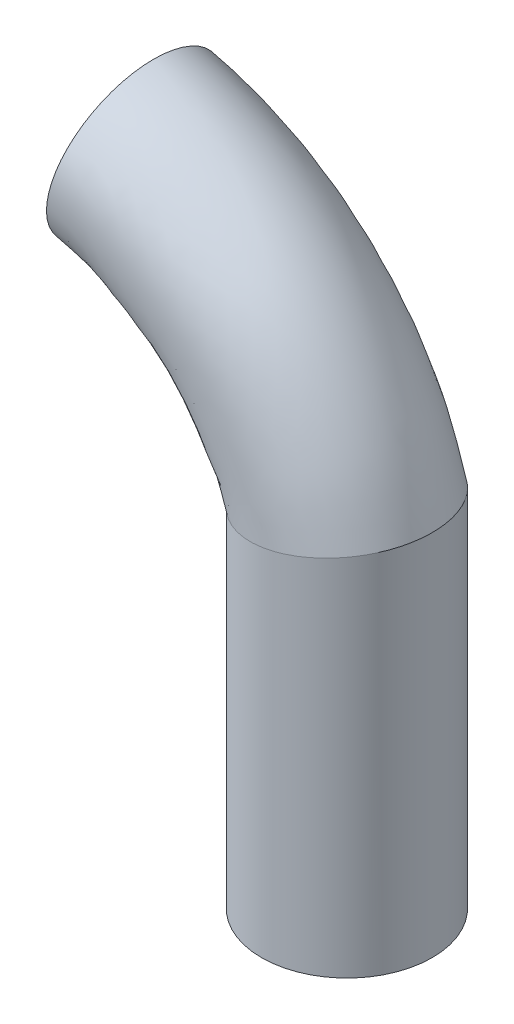
ISO-10303-21;
HEADER;
FILE_DESCRIPTION(('STEP AP214'),'2;1');
FILE_NAME('part.step','',(''),(''),'','','');
FILE_SCHEMA(('AUTOMOTIVE_DESIGN { 1 0 10303 214 1 1 1 1 }'));
ENDSEC;
DATA;
#1=APPLICATION_CONTEXT('core data for automotive mechanical design processes');
#2=APPLICATION_PROTOCOL_DEFINITION('international standard','automotive_design',2000,#1);
#3=PRODUCT_CONTEXT('',#1,'mechanical');
#4=PRODUCT('Part','Part','',(#3));
#5=PRODUCT_RELATED_PRODUCT_CATEGORY('part','',(#4));
#6=PRODUCT_DEFINITION_FORMATION('','',#4);
#7=PRODUCT_DEFINITION_CONTEXT('part definition',#1,'design');
#8=PRODUCT_DEFINITION('design','',#6,#7);
#9=PRODUCT_DEFINITION_SHAPE('','',#8);
#10=(LENGTH_UNIT() NAMED_UNIT(*) SI_UNIT(.MILLI.,.METRE.));
#11=(NAMED_UNIT(*) PLANE_ANGLE_UNIT() SI_UNIT($,.RADIAN.));
#12=(NAMED_UNIT(*) SI_UNIT($,.STERADIAN.) SOLID_ANGLE_UNIT());
#13=UNCERTAINTY_MEASURE_WITH_UNIT(LENGTH_MEASURE(1.E-05),#10,'distance_accuracy_value','');
#14=(GEOMETRIC_REPRESENTATION_CONTEXT(3) GLOBAL_UNCERTAINTY_ASSIGNED_CONTEXT((#13)) GLOBAL_UNIT_ASSIGNED_CONTEXT((#10,
#11,#12)) REPRESENTATION_CONTEXT('',''));
#15=CARTESIAN_POINT('',(0.,0.,0.));
#16=DIRECTION('',(0.,0.,1.));
#17=DIRECTION('',(1.,0.,0.));
#18=AXIS2_PLACEMENT_3D('',#15,#16,#17);
#19=CARTESIAN_POINT('',(0.,0.,0.));
#20=DIRECTION('',(0.,1.,0.));
#21=DIRECTION('',(0.,0.,1.));
#22=AXIS2_PLACEMENT_3D('',#19,#20,#21);
#23=PLANE('',#22);
#24=CARTESIAN_POINT('',(0.,0.,0.));
#25=DIRECTION('',(0.,1.,0.));
#26=DIRECTION('',(0.,0.,1.));
#27=AXIS2_PLACEMENT_3D('',#24,#25,#26);
#28=CIRCLE('',#27,12.);
#29=CARTESIAN_POINT('',(0.,0.,12.));
#30=VERTEX_POINT('',#29);
#31=EDGE_CURVE('E50',#30,#30,#28,.T.);
#32=ORIENTED_EDGE('',*,*,#31,.F.);
#33=EDGE_LOOP('',(#32));
#34=FACE_BOUND('',#33,.T.);
#35=CARTESIAN_POINT('',(0.,0.,0.));
#36=DIRECTION('',(0.,1.,0.));
#37=DIRECTION('',(0.,0.,1.));
#38=AXIS2_PLACEMENT_3D('',#35,#36,#37);
#39=CIRCLE('',#38,10.);
#40=CARTESIAN_POINT('',(0.,0.,10.));
#41=VERTEX_POINT('',#40);
#42=EDGE_CURVE('E63',#41,#41,#39,.T.);
#43=ORIENTED_EDGE('',*,*,#42,.T.);
#44=EDGE_LOOP('',(#43));
#45=FACE_BOUND('',#44,.T.);
#46=ADVANCED_FACE('F43',(#34,#45),#23,.F.);
#47=CARTESIAN_POINT('',(0.,83.9411254969543,0.));
#48=DIRECTION('',(0.,-1.,0.));
#49=DIRECTION('',(0.,0.,-1.));
#50=AXIS2_PLACEMENT_3D('',#47,#48,#49);
#51=CYLINDRICAL_SURFACE('',#50,12.);
#52=ORIENTED_EDGE('',*,*,#31,.T.);
#53=EDGE_LOOP('',(#52));
#54=FACE_BOUND('',#53,.T.);
#55=CARTESIAN_POINT('',(0.,50.,0.));
#56=DIRECTION('',(-0.145731138414527,0.989324231633091,0.));
#57=DIRECTION('',(-0.989324231633091,-0.145731138414527,0.));
#58=AXIS2_PLACEMENT_3D('',#55,#56,#57);
#59=ELLIPSE('',#58,12.1294916431911,12.);
#60=CARTESIAN_POINT('',(-12.,48.2323553744483,0.));
#61=VERTEX_POINT('',#60);
#62=EDGE_CURVE('E11',#61,#61,#59,.T.);
#63=ORIENTED_EDGE('',*,*,#62,.F.);
#64=EDGE_LOOP('',(#63));
#65=FACE_BOUND('',#64,.T.);
#66=ADVANCED_FACE('F45',(#54,#65),#51,.T.);
#67=CARTESIAN_POINT('',(-27.1865244931937,89.8319749303473,0.));
#68=DIRECTION('',(0.973416209225749,-0.229043409895531,0.));
#69=DIRECTION('',(0.229043409895531,0.973416209225749,0.));
#70=AXIS2_PLACEMENT_3D('',#67,#68,#69);
#71=PLANE('',#70);
#72=CARTESIAN_POINT('',(-29.9350454119401,78.1509804196383,0.));
#73=DIRECTION('',(0.973416209225749,-0.229043409895532,0.));
#74=DIRECTION('',(0.229043409895532,0.973416209225749,0.));
#75=AXIS2_PLACEMENT_3D('',#72,#73,#74);
#76=CIRCLE('',#75,10.);
#77=CARTESIAN_POINT('',(-27.6446113129848,87.8851425118958,0.));
#78=VERTEX_POINT('',#77);
#79=EDGE_CURVE('E66',#78,#78,#76,.T.);
#80=ORIENTED_EDGE('',*,*,#79,.T.);
#81=EDGE_LOOP('',(#80));
#82=FACE_BOUND('',#81,.T.);
#83=CARTESIAN_POINT('',(-29.9350454119401,78.1509804196383,0.));
#84=DIRECTION('',(0.973416209225749,-0.229043409895531,0.));
#85=DIRECTION('',(0.229043409895531,0.973416209225749,0.));
#86=AXIS2_PLACEMENT_3D('',#83,#84,#85);
#87=CIRCLE('',#86,12.);
#88=CARTESIAN_POINT('',(-27.1865244931937,89.8319749303473,0.));
#89=VERTEX_POINT('',#88);
#90=EDGE_CURVE('E54',#89,#89,#87,.T.);
#91=ORIENTED_EDGE('',*,*,#90,.F.);
#92=EDGE_LOOP('',(#91));
#93=FACE_BOUND('',#92,.T.);
#94=ADVANCED_FACE('F70',(#82,#93),#71,.F.);
#95=CARTESIAN_POINT('',(-12.,48.2323553744483,0.));
#96=CARTESIAN_POINT('',(-12.7534189153168,50.734230232803,0.));
#97=CARTESIAN_POINT('',(-14.0574493505172,52.632841728253,0.));
#98=CARTESIAN_POINT('',(-17.3401531125662,57.5272148967779,0.));
#99=CARTESIAN_POINT('',(-21.3478893027379,61.2998523237319,0.));
#100=CARTESIAN_POINT('',(-27.1475196938969,64.7183055808548,0.));
#101=CARTESIAN_POINT('',(-29.6803034720161,65.7633225521422,0.));
#102=CARTESIAN_POINT('',(-32.6835663306864,66.4699859089293,0.));
#103=CARTESIAN_POINT('',(-12.,48.2323553744483,24.));
#104=CARTESIAN_POINT('',(-13.5135996529393,53.258559044569,24.));
#105=CARTESIAN_POINT('',(-13.6706797899976,51.4174086569918,24.));
#106=CARTESIAN_POINT('',(-17.5214616967647,57.8782619977604,24.));
#107=CARTESIAN_POINT('',(-20.98738055443,61.1156205697922,24.));
#108=CARTESIAN_POINT('',(-28.5927876392981,65.0875673302378,24.));
#109=CARTESIAN_POINT('',(-26.7130080435762,65.0651222790669,24.));
#110=CARTESIAN_POINT('',(-32.6835663306864,66.4699859089293,24.));
#111=CARTESIAN_POINT('',(12.,51.7676446255517,24.));
#112=CARTESIAN_POINT('',(10.4864003470607,56.7938482956724,24.));
#113=CARTESIAN_POINT('',(8.89630519086534,61.0426016719502,24.));
#114=CARTESIAN_POINT('',(2.7144854367518,71.2312181352267,24.));
#115=CARTESIAN_POINT('',(-4.95506729208265,79.266728410204,24.));
#116=CARTESIAN_POINT('',(-16.2196387285254,86.2638680161331,24.));
#117=CARTESIAN_POINT('',(-21.2159662060835,88.4271113004849,24.));
#118=CARTESIAN_POINT('',(-27.1865244931937,89.8319749303473,24.));
#119=CARTESIAN_POINT('',(12.,51.7676446255517,0.));
#120=CARTESIAN_POINT('',(10.866490715872,55.5316838897894,0.));
#121=CARTESIAN_POINT('',(8.70292041060554,61.6503182075808,0.));
#122=CARTESIAN_POINT('',(2.80513972885107,71.0556945847354,0.));
#123=CARTESIAN_POINT('',(-5.1353216662366,79.3588442871738,0.));
#124=CARTESIAN_POINT('',(-15.4970047558247,86.0792371414416,0.));
#125=CARTESIAN_POINT('',(-22.6996139203035,88.7762114370226,0.));
#126=CARTESIAN_POINT('',(-27.1865244931937,89.8319749303473,0.));
#127=CARTESIAN_POINT('',(12.,51.7676446255517,-24.));
#128=CARTESIAN_POINT('',(11.2465810846833,54.2695194839065,-24.));
#129=CARTESIAN_POINT('',(8.50953563034573,62.2580347432115,-24.));
#130=CARTESIAN_POINT('',(2.89579402095035,70.8801710342442,-24.));
#131=CARTESIAN_POINT('',(-5.31557604039056,79.4509601641437,-24.));
#132=CARTESIAN_POINT('',(-14.7743707831241,85.8946062667501,-24.));
#133=CARTESIAN_POINT('',(-24.1832616345234,89.1253115735602,-24.));
#134=CARTESIAN_POINT('',(-27.1865244931937,89.8319749303473,-24.));
#135=CARTESIAN_POINT('',(-12.,48.2323553744483,-24.));
#136=CARTESIAN_POINT('',(-11.9932381776942,48.2099014210371,-24.));
#137=CARTESIAN_POINT('',(-14.4442189110368,53.8482747995142,-24.));
#138=CARTESIAN_POINT('',(-17.1588445283676,57.1761677957954,-24.));
#139=CARTESIAN_POINT('',(-21.7083980510459,61.4840840776716,-24.));
#140=CARTESIAN_POINT('',(-25.7022517484956,64.3490438314719,-24.));
#141=CARTESIAN_POINT('',(-32.6475989004561,66.4615228252174,-24.));
#142=CARTESIAN_POINT('',(-32.6835663306864,66.4699859089293,-24.));
#143=CARTESIAN_POINT('',(-12.,48.2323553744483,0.));
#144=CARTESIAN_POINT('',(-12.7534189153168,50.734230232803,0.));
#145=CARTESIAN_POINT('',(-14.0574493505172,52.632841728253,0.));
#146=CARTESIAN_POINT('',(-17.3401531125662,57.5272148967779,0.));
#147=CARTESIAN_POINT('',(-21.3478893027379,61.2998523237319,0.));
#148=CARTESIAN_POINT('',(-27.1475196938969,64.7183055808548,0.));
#149=CARTESIAN_POINT('',(-29.6803034720161,65.7633225521422,0.));
#150=CARTESIAN_POINT('',(-32.6835663306864,66.4699859089293,0.));
#151=(BOUNDED_SURFACE() B_SPLINE_SURFACE(3,3,((#95,#96,#97,#98,#99,#100,#101,#102),(#103,#104,
#105,#106,#107,#108,#109,#110),(#111,#112,#113,#114,#115,#116,#117,#118),(#119,#120,#121,#122,
#123,#124,#125,#126),(#127,#128,#129,#130,#131,#132,#133,#134),(#135,#136,#137,#138,#139,#140,
#141,#142),(#143,#144,#145,#146,#147,#148,#149,#150)),.UNSPECIFIED.,.T.,.F.,
.F.) B_SPLINE_SURFACE_WITH_KNOTS((4,3,4),(4,1,1,1,1,4),(0.,0.5,1.),(0.,0.182343539284317,
0.37061739624682,0.561386437683663,0.784461655786764,1.),
.UNSPECIFIED.) GEOMETRIC_REPRESENTATION_ITEM() RATIONAL_B_SPLINE_SURFACE(((1.,1.,1.,1.,1.,1.,1.,
1.),(0.333333333333333,0.333333333333333,0.333333333333333,0.333333333333333,0.333333333333333,
0.333333333333333,0.333333333333333,0.333333333333333),(0.333333333333333,0.333333333333333,
0.333333333333333,0.333333333333333,0.333333333333333,0.333333333333333,0.333333333333333,
0.333333333333333),(1.,1.,1.,1.,1.,1.,1.,1.),(0.333333333333333,0.333333333333333,
0.333333333333333,0.333333333333333,0.333333333333333,0.333333333333333,0.333333333333333,
0.333333333333333),(0.333333333333333,0.333333333333333,0.333333333333333,0.333333333333333,
0.333333333333333,0.333333333333333,0.333333333333333,0.333333333333333),(1.,1.,1.,1.,1.,1.,1.,1.))) REPRESENTATION_ITEM('') SURFACE());
#152=ORIENTED_EDGE('',*,*,#62,.T.);
#153=EDGE_LOOP('',(#152));
#154=FACE_BOUND('',#153,.T.);
#155=ORIENTED_EDGE('',*,*,#90,.T.);
#156=EDGE_LOOP('',(#155));
#157=FACE_BOUND('',#156,.T.);
#158=ADVANCED_FACE('F81',(#154,#157),#151,.T.);
#159=CARTESIAN_POINT('',(0.,78.2842712474619,0.));
#160=DIRECTION('',(0.,-1.,0.));
#161=DIRECTION('',(0.,0.,-1.));
#162=AXIS2_PLACEMENT_3D('',#159,#160,#161);
#163=CYLINDRICAL_SURFACE('',#162,10.);
#164=ORIENTED_EDGE('',*,*,#42,.F.);
#165=EDGE_LOOP('',(#164));
#166=FACE_BOUND('',#165,.T.);
#167=CARTESIAN_POINT('',(0.,50.,0.));
#168=DIRECTION('',(-0.145731138414527,0.989324231633091,0.));
#169=DIRECTION('',(-0.989324231633091,-0.145731138414527,0.));
#170=AXIS2_PLACEMENT_3D('',#167,#168,#169);
#171=ELLIPSE('',#170,10.1079097026592,10.);
#172=CARTESIAN_POINT('',(-10.,48.5269628120402,0.));
#173=VERTEX_POINT('',#172);
#174=EDGE_CURVE('E58',#173,#173,#171,.T.);
#175=ORIENTED_EDGE('',*,*,#174,.T.);
#176=EDGE_LOOP('',(#175));
#177=FACE_BOUND('',#176,.T.);
#178=ADVANCED_FACE('F75',(#166,#177),#163,.F.);
#179=CARTESIAN_POINT('',(-10.,48.5269628120402,0.));
#180=CARTESIAN_POINT('',(-10.752933462101,51.0272256280495,0.));
#181=CARTESIAN_POINT('',(-11.4223448476634,51.8541302440534,0.));
#182=CARTESIAN_POINT('',(-15.1388236360498,58.1305398622563,0.));
#183=CARTESIAN_POINT('',(-19.5495988510908,62.4237210676715,0.));
#184=CARTESIAN_POINT('',(-25.7944010186711,66.3723059365797,0.));
#185=CARTESIAN_POINT('',(-29.2222465257194,67.7101619997832,0.));
#186=CARTESIAN_POINT('',(-32.2254795108954,68.4168183273808,0.));
#187=CARTESIAN_POINT('',(-10.,48.5269628120402,20.));
#188=CARTESIAN_POINT('',(-11.7241529856829,54.2523500025435,20.));
#189=CARTESIAN_POINT('',(-10.9269354085975,50.2584544624459,20.));
#190=CARTESIAN_POINT('',(-15.3319878781612,58.5864275180529,20.));
#191=CARTESIAN_POINT('',(-19.2643535304719,62.224411763424,20.));
#192=CARTESIAN_POINT('',(-26.8662428943531,66.6633285599055,20.));
#193=CARTESIAN_POINT('',(-27.0324830320953,67.194913853419,20.));
#194=CARTESIAN_POINT('',(-32.2254795108954,68.4168183273808,20.));
#195=CARTESIAN_POINT('',(10.,51.4730371879598,20.));
#196=CARTESIAN_POINT('',(8.27584701431709,57.198424378463,20.));
#197=CARTESIAN_POINT('',(6.23557951557228,61.6961356741871,20.));
#198=CARTESIAN_POINT('',(0.514582264958525,70.6973509414463,20.));
#199=CARTESIAN_POINT('',(-6.82625984672717,78.133811690848,20.));
#200=CARTESIAN_POINT('',(-17.2017092792031,84.530553077177,20.));
#201=CARTESIAN_POINT('',(-22.4516148341846,86.663238037934,20.));
#202=CARTESIAN_POINT('',(-27.6446113129848,87.8851425118958,20.));
#203=CARTESIAN_POINT('',(10.,51.4730371879598,0.));
#204=CARTESIAN_POINT('',(8.76145677610804,55.585862191216,0.));
#205=CARTESIAN_POINT('',(5.98787479603933,62.4939735649909,0.));
#206=CARTESIAN_POINT('',(0.611164386014191,70.469407113548,0.));
#207=CARTESIAN_POINT('',(-6.96888250703658,78.2334663429718,0.));
#208=CARTESIAN_POINT('',(-16.6657883413621,84.3850417655141,0.));
#209=CARTESIAN_POINT('',(-23.5464965809967,86.9208621111161,0.));
#210=CARTESIAN_POINT('',(-27.6446113129848,87.8851425118958,0.));
#211=CARTESIAN_POINT('',(10.,51.4730371879598,-20.));
#212=CARTESIAN_POINT('',(9.24706653789899,53.9733000039691,-20.));
#213=CARTESIAN_POINT('',(5.74017007650637,63.2918114557947,-20.));
#214=CARTESIAN_POINT('',(0.707746507069855,70.2414632856497,-20.));
#215=CARTESIAN_POINT('',(-7.11150516734599,78.3331209950954,-20.));
#216=CARTESIAN_POINT('',(-16.1298674035211,84.2395304538513,-20.));
#217=CARTESIAN_POINT('',(-24.6413783278088,87.1784861842982,-20.));
#218=CARTESIAN_POINT('',(-27.6446113129848,87.8851425118958,-20.));
#219=CARTESIAN_POINT('',(-10.,48.5269628120402,-20.));
#220=CARTESIAN_POINT('',(-9.78171393851913,47.8021012535556,-20.));
#221=CARTESIAN_POINT('',(-11.9177542867293,53.449806025661,-20.));
#222=CARTESIAN_POINT('',(-14.9456593939385,57.6746522064598,-20.));
#223=CARTESIAN_POINT('',(-19.8348441717096,62.6230303719189,-20.));
#224=CARTESIAN_POINT('',(-24.7225591429891,66.0812833132539,-20.));
#225=CARTESIAN_POINT('',(-31.4120100193435,68.2254101461474,-20.));
#226=CARTESIAN_POINT('',(-32.2254795108954,68.4168183273808,-20.));
#227=CARTESIAN_POINT('',(-10.,48.5269628120402,0.));
#228=CARTESIAN_POINT('',(-10.752933462101,51.0272256280495,0.));
#229=CARTESIAN_POINT('',(-11.4223448476634,51.8541302440534,0.));
#230=CARTESIAN_POINT('',(-15.1388236360498,58.1305398622563,0.));
#231=CARTESIAN_POINT('',(-19.5495988510908,62.4237210676715,0.));
#232=CARTESIAN_POINT('',(-25.7944010186711,66.3723059365797,0.));
#233=CARTESIAN_POINT('',(-29.2222465257194,67.7101619997832,0.));
#234=CARTESIAN_POINT('',(-32.2254795108954,68.4168183273808,0.));
#235=(BOUNDED_SURFACE() B_SPLINE_SURFACE(3,3,((#179,#180,#181,#182,#183,#184,#185,#186),(#187,
#188,#189,#190,#191,#192,#193,#194),(#195,#196,#197,#198,#199,#200,#201,#202),(#203,#204,#205,
#206,#207,#208,#209,#210),(#211,#212,#213,#214,#215,#216,#217,#218),(#219,#220,#221,#222,#223,
#224,#225,#226),(#227,#228,#229,#230,#231,#232,#233,#234)),.UNSPECIFIED.,.T.,.F.,
.F.) B_SPLINE_SURFACE_WITH_KNOTS((4,3,4),(4,1,1,1,1,4),(0.,0.5,1.),(0.,0.178238854896836,
0.367500962333193,0.559303115087345,0.783408707716879,1.),
.UNSPECIFIED.) GEOMETRIC_REPRESENTATION_ITEM() RATIONAL_B_SPLINE_SURFACE(((1.,1.,1.,1.,1.,1.,1.,
1.),(0.333333333333333,0.333333333333333,0.333333333333333,0.333333333333333,0.333333333333333,
0.333333333333333,0.333333333333333,0.333333333333333),(0.333333333333333,0.333333333333333,
0.333333333333333,0.333333333333333,0.333333333333333,0.333333333333333,0.333333333333333,
0.333333333333333),(1.,1.,1.,1.,1.,1.,1.,1.),(0.333333333333333,0.333333333333333,
0.333333333333333,0.333333333333333,0.333333333333333,0.333333333333333,0.333333333333333,
0.333333333333333),(0.333333333333333,0.333333333333333,0.333333333333333,0.333333333333333,
0.333333333333333,0.333333333333333,0.333333333333333,0.333333333333333),(1.,1.,1.,1.,1.,1.,1.,1.))) REPRESENTATION_ITEM('') SURFACE());
#236=ORIENTED_EDGE('',*,*,#174,.F.);
#237=EDGE_LOOP('',(#236));
#238=FACE_BOUND('',#237,.T.);
#239=ORIENTED_EDGE('',*,*,#79,.F.);
#240=EDGE_LOOP('',(#239));
#241=FACE_BOUND('',#240,.T.);
#242=ADVANCED_FACE('F73',(#238,#241),#235,.F.);
#243=CLOSED_SHELL('',(#46,#66,#94,#158,#178,#242));
#244=MANIFOLD_SOLID_BREP('B2',#243);
#245=ADVANCED_BREP_SHAPE_REPRESENTATION('',(#18,#244),#14);
#246=SHAPE_DEFINITION_REPRESENTATION(#9,#245);
ENDSEC;
END-ISO-10303-21;
